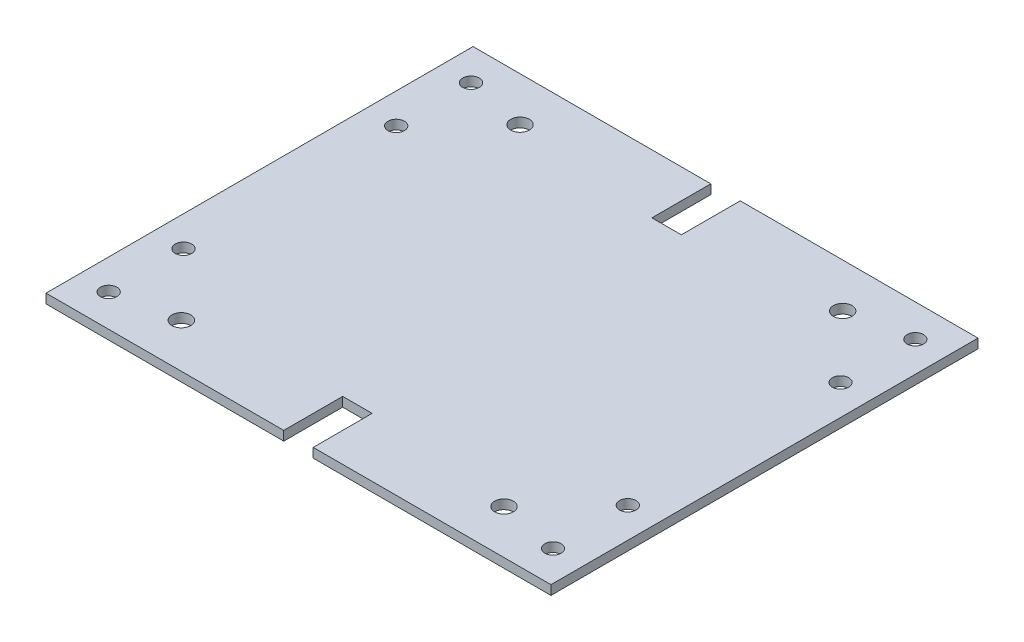
ISO-10303-21;
HEADER;
FILE_DESCRIPTION(('STEP AP214'),'2;1');
FILE_NAME('part.step','',(''),(''),'','','');
FILE_SCHEMA(('AUTOMOTIVE_DESIGN { 1 0 10303 214 1 1 1 1 }'));
ENDSEC;
DATA;
#1=APPLICATION_CONTEXT('core data for automotive mechanical design processes');
#2=APPLICATION_PROTOCOL_DEFINITION('international standard','automotive_design',2000,#1);
#3=PRODUCT_CONTEXT('',#1,'mechanical');
#4=PRODUCT('Part','Part','',(#3));
#5=PRODUCT_RELATED_PRODUCT_CATEGORY('part','',(#4));
#6=PRODUCT_DEFINITION_FORMATION('','',#4);
#7=PRODUCT_DEFINITION_CONTEXT('part definition',#1,'design');
#8=PRODUCT_DEFINITION('design','',#6,#7);
#9=PRODUCT_DEFINITION_SHAPE('','',#8);
#10=(LENGTH_UNIT() NAMED_UNIT(*) SI_UNIT(.MILLI.,.METRE.));
#11=(NAMED_UNIT(*) PLANE_ANGLE_UNIT() SI_UNIT($,.RADIAN.));
#12=(NAMED_UNIT(*) SI_UNIT($,.STERADIAN.) SOLID_ANGLE_UNIT());
#13=UNCERTAINTY_MEASURE_WITH_UNIT(LENGTH_MEASURE(1.E-05),#10,'distance_accuracy_value','');
#14=(GEOMETRIC_REPRESENTATION_CONTEXT(3) GLOBAL_UNCERTAINTY_ASSIGNED_CONTEXT((#13)) GLOBAL_UNIT_ASSIGNED_CONTEXT((#10,
#11,#12)) REPRESENTATION_CONTEXT('',''));
#15=CARTESIAN_POINT('',(0.,0.,0.));
#16=DIRECTION('',(0.,0.,1.));
#17=DIRECTION('',(1.,0.,0.));
#18=AXIS2_PLACEMENT_3D('',#15,#16,#17);
#19=CARTESIAN_POINT('',(0.,3.175,0.));
#20=DIRECTION('',(0.,1.,0.));
#21=DIRECTION('',(0.,0.,1.));
#22=AXIS2_PLACEMENT_3D('',#19,#20,#21);
#23=PLANE('',#22);
#24=CARTESIAN_POINT('',(145.213,3.175,-134.0145));
#25=DIRECTION('',(0.,-1.,0.));
#26=DIRECTION('',(0.,0.,-1.));
#27=AXIS2_PLACEMENT_3D('',#24,#25,#26);
#28=CIRCLE('',#27,2.79399999999998);
#29=CARTESIAN_POINT('',(145.213,3.175,-136.8085));
#30=VERTEX_POINT('',#29);
#31=EDGE_CURVE('E1172',#30,#30,#28,.T.);
#32=ORIENTED_EDGE('',*,*,#31,.T.);
#33=EDGE_LOOP('',(#32));
#34=FACE_BOUND('',#33,.T.);
#35=CARTESIAN_POINT('',(145.213,3.175,-108.6145));
#36=DIRECTION('',(0.,-1.,0.));
#37=DIRECTION('',(0.,0.,-1.));
#38=AXIS2_PLACEMENT_3D('',#35,#36,#37);
#39=CIRCLE('',#38,2.79399999999998);
#40=CARTESIAN_POINT('',(145.213,3.175,-111.4085));
#41=VERTEX_POINT('',#40);
#42=EDGE_CURVE('E1166',#41,#41,#39,.T.);
#43=ORIENTED_EDGE('',*,*,#42,.T.);
#44=EDGE_LOOP('',(#43));
#45=FACE_BOUND('',#44,.T.);
#46=CARTESIAN_POINT('',(145.213,3.175,-10.9855));
#47=DIRECTION('',(0.,1.,0.));
#48=DIRECTION('',(0.,0.,1.));
#49=AXIS2_PLACEMENT_3D('',#46,#47,#48);
#50=CIRCLE('',#49,2.79399999999998);
#51=CARTESIAN_POINT('',(145.213,3.175,-8.19150000000003));
#52=VERTEX_POINT('',#51);
#53=EDGE_CURVE('E1154',#52,#52,#50,.T.);
#54=ORIENTED_EDGE('',*,*,#53,.F.);
#55=EDGE_LOOP('',(#54));
#56=FACE_BOUND('',#55,.T.);
#57=CARTESIAN_POINT('',(-5.663,3.175,-10.9855));
#58=DIRECTION('',(0.,-1.,0.));
#59=DIRECTION('',(0.,0.,-1.));
#60=AXIS2_PLACEMENT_3D('',#57,#58,#59);
#61=CIRCLE('',#60,2.794);
#62=CARTESIAN_POINT('',(-5.663,3.175,-13.7795));
#63=VERTEX_POINT('',#62);
#64=EDGE_CURVE('E1148',#63,#63,#61,.T.);
#65=ORIENTED_EDGE('',*,*,#64,.T.);
#66=EDGE_LOOP('',(#65));
#67=FACE_BOUND('',#66,.T.);
#68=CARTESIAN_POINT('',(-5.663,3.175,-36.3855));
#69=DIRECTION('',(0.,-1.,0.));
#70=DIRECTION('',(0.,0.,-1.));
#71=AXIS2_PLACEMENT_3D('',#68,#69,#70);
#72=CIRCLE('',#71,2.794);
#73=CARTESIAN_POINT('',(-5.663,3.175,-39.1795));
#74=VERTEX_POINT('',#73);
#75=EDGE_CURVE('E1142',#74,#74,#72,.T.);
#76=ORIENTED_EDGE('',*,*,#75,.T.);
#77=EDGE_LOOP('',(#76));
#78=FACE_BOUND('',#77,.T.);
#79=CARTESIAN_POINT('',(-5.663,3.175,-134.0145));
#80=DIRECTION('',(0.,1.,0.));
#81=DIRECTION('',(0.,0.,1.));
#82=AXIS2_PLACEMENT_3D('',#79,#80,#81);
#83=CIRCLE('',#82,2.794);
#84=CARTESIAN_POINT('',(-5.663,3.175,-131.2205));
#85=VERTEX_POINT('',#84);
#86=EDGE_CURVE('E1130',#85,#85,#83,.T.);
#87=ORIENTED_EDGE('',*,*,#86,.F.);
#88=EDGE_LOOP('',(#87));
#89=FACE_BOUND('',#88,.T.);
#90=CARTESIAN_POINT('',(15.,3.175,-15.));
#91=DIRECTION('',(0.,-1.,0.));
#92=DIRECTION('',(0.,0.,-1.));
#93=AXIS2_PLACEMENT_3D('',#90,#91,#92);
#94=CIRCLE('',#93,3.175);
#95=CARTESIAN_POINT('',(15.,3.175,-18.175));
#96=VERTEX_POINT('',#95);
#97=EDGE_CURVE('E1124',#96,#96,#94,.T.);
#98=ORIENTED_EDGE('',*,*,#97,.T.);
#99=EDGE_LOOP('',(#98));
#100=FACE_BOUND('',#99,.T.);
#101=CARTESIAN_POINT('',(124.55,3.175,-15.));
#102=DIRECTION('',(0.,1.,0.));
#103=DIRECTION('',(0.,0.,1.));
#104=AXIS2_PLACEMENT_3D('',#101,#102,#103);
#105=CIRCLE('',#104,3.175);
#106=CARTESIAN_POINT('',(124.55,3.175,-11.825));
#107=VERTEX_POINT('',#106);
#108=EDGE_CURVE('E771',#107,#107,#105,.T.);
#109=ORIENTED_EDGE('',*,*,#108,.F.);
#110=EDGE_LOOP('',(#109));
#111=FACE_BOUND('',#110,.T.);
#112=DIRECTION('',(0.,0.,1.));
#113=VECTOR('',#112,1.);
#114=CARTESIAN_POINT('',(74.775,3.175,-20.));
#115=LINE('',#114,#113);
#116=CARTESIAN_POINT('',(74.775,3.175,-20.));
#117=VERTEX_POINT('',#116);
#118=CARTESIAN_POINT('',(74.775,3.175,0.));
#119=VERTEX_POINT('',#118);
#120=EDGE_CURVE('E797',#117,#119,#115,.T.);
#121=ORIENTED_EDGE('',*,*,#120,.T.);
#122=DIRECTION('',(1.,0.,0.));
#123=VECTOR('',#122,1.);
#124=CARTESIAN_POINT('',(74.775,3.175,0.));
#125=LINE('',#124,#123);
#126=CARTESIAN_POINT('',(155.5,3.175,0.));
#127=VERTEX_POINT('',#126);
#128=EDGE_CURVE('E716',#119,#127,#125,.T.);
#129=ORIENTED_EDGE('',*,*,#128,.T.);
#130=DIRECTION('',(0.,0.,1.));
#131=VECTOR('',#130,1.);
#132=CARTESIAN_POINT('',(155.5,3.175,-145.));
#133=LINE('',#132,#131);
#134=CARTESIAN_POINT('',(155.5,3.175,-145.));
#135=VERTEX_POINT('',#134);
#136=EDGE_CURVE('E821',#135,#127,#133,.T.);
#137=ORIENTED_EDGE('',*,*,#136,.F.);
#138=DIRECTION('',(1.,0.,0.));
#139=VECTOR('',#138,1.);
#140=CARTESIAN_POINT('',(139.55,3.175,-145.));
#141=LINE('',#140,#139);
#142=CARTESIAN_POINT('',(74.775,3.175,-145.));
#143=VERTEX_POINT('',#142);
#144=EDGE_CURVE('E834',#143,#135,#141,.T.);
#145=ORIENTED_EDGE('',*,*,#144,.F.);
#146=DIRECTION('',(0.,0.,1.));
#147=VECTOR('',#146,1.);
#148=CARTESIAN_POINT('',(74.775,3.175,-145.));
#149=LINE('',#148,#147);
#150=CARTESIAN_POINT('',(74.775,3.175,-125.));
#151=VERTEX_POINT('',#150);
#152=EDGE_CURVE('E836',#143,#151,#149,.T.);
#153=ORIENTED_EDGE('',*,*,#152,.T.);
#154=DIRECTION('',(1.,0.,0.));
#155=VECTOR('',#154,1.);
#156=CARTESIAN_POINT('',(64.775,3.175,-125.));
#157=LINE('',#156,#155);
#158=CARTESIAN_POINT('',(64.775,3.175,-125.));
#159=VERTEX_POINT('',#158);
#160=EDGE_CURVE('E842',#159,#151,#157,.T.);
#161=ORIENTED_EDGE('',*,*,#160,.F.);
#162=DIRECTION('',(0.,0.,1.));
#163=VECTOR('',#162,1.);
#164=CARTESIAN_POINT('',(64.775,3.175,-130.));
#165=LINE('',#164,#163);
#166=CARTESIAN_POINT('',(64.775,3.175,-145.));
#167=VERTEX_POINT('',#166);
#168=EDGE_CURVE('E845',#167,#159,#165,.T.);
#169=ORIENTED_EDGE('',*,*,#168,.F.);
#170=DIRECTION('',(1.,0.,0.));
#171=VECTOR('',#170,1.);
#172=CARTESIAN_POINT('',(0.,3.175,-145.));
#173=LINE('',#172,#171);
#174=CARTESIAN_POINT('',(-15.95,3.175,-145.));
#175=VERTEX_POINT('',#174);
#176=EDGE_CURVE('E848',#175,#167,#173,.T.);
#177=ORIENTED_EDGE('',*,*,#176,.F.);
#178=DIRECTION('',(0.,0.,1.));
#179=VECTOR('',#178,1.);
#180=CARTESIAN_POINT('',(-15.95,3.175,-145.));
#181=LINE('',#180,#179);
#182=CARTESIAN_POINT('',(-15.95,3.175,0.));
#183=VERTEX_POINT('',#182);
#184=EDGE_CURVE('E747',#175,#183,#181,.T.);
#185=ORIENTED_EDGE('',*,*,#184,.T.);
#186=DIRECTION('',(-1.,0.,0.));
#187=VECTOR('',#186,1.);
#188=CARTESIAN_POINT('',(0.,3.175,0.));
#189=LINE('',#188,#187);
#190=CARTESIAN_POINT('',(64.775,3.175,0.));
#191=VERTEX_POINT('',#190);
#192=EDGE_CURVE('E741',#191,#183,#189,.T.);
#193=ORIENTED_EDGE('',*,*,#192,.F.);
#194=DIRECTION('',(0.,0.,1.));
#195=VECTOR('',#194,1.);
#196=CARTESIAN_POINT('',(64.775,3.175,-20.));
#197=LINE('',#196,#195);
#198=CARTESIAN_POINT('',(64.775,3.175,-20.));
#199=VERTEX_POINT('',#198);
#200=EDGE_CURVE('E745',#199,#191,#197,.T.);
#201=ORIENTED_EDGE('',*,*,#200,.F.);
#202=DIRECTION('',(1.,0.,0.));
#203=VECTOR('',#202,1.);
#204=CARTESIAN_POINT('',(64.775,3.175,-20.));
#205=LINE('',#204,#203);
#206=EDGE_CURVE('E665',#199,#117,#205,.T.);
#207=ORIENTED_EDGE('',*,*,#206,.T.);
#208=EDGE_LOOP('',(#121,#129,#137,#145,#153,#161,#169,#177,#185,#193,#201,#207));
#209=FACE_BOUND('',#208,.T.);
#210=CARTESIAN_POINT('',(124.55,3.175,-130.));
#211=DIRECTION('',(0.,-1.,0.));
#212=DIRECTION('',(0.,0.,-1.));
#213=AXIS2_PLACEMENT_3D('',#210,#211,#212);
#214=CIRCLE('',#213,3.175);
#215=CARTESIAN_POINT('',(124.55,3.175,-133.175));
#216=VERTEX_POINT('',#215);
#217=EDGE_CURVE('E1112',#216,#216,#214,.T.);
#218=ORIENTED_EDGE('',*,*,#217,.T.);
#219=EDGE_LOOP('',(#218));
#220=FACE_BOUND('',#219,.T.);
#221=CARTESIAN_POINT('',(15.,3.175,-130.));
#222=DIRECTION('',(0.,1.,0.));
#223=DIRECTION('',(0.,0.,1.));
#224=AXIS2_PLACEMENT_3D('',#221,#222,#223);
#225=CIRCLE('',#224,3.175);
#226=CARTESIAN_POINT('',(15.,3.175,-126.825));
#227=VERTEX_POINT('',#226);
#228=EDGE_CURVE('E1118',#227,#227,#225,.T.);
#229=ORIENTED_EDGE('',*,*,#228,.F.);
#230=EDGE_LOOP('',(#229));
#231=FACE_BOUND('',#230,.T.);
#232=CARTESIAN_POINT('',(-5.663,3.175,-108.6145));
#233=DIRECTION('',(0.,1.,0.));
#234=DIRECTION('',(0.,0.,1.));
#235=AXIS2_PLACEMENT_3D('',#232,#233,#234);
#236=CIRCLE('',#235,2.79400000000001);
#237=CARTESIAN_POINT('',(-5.663,3.175,-105.8205));
#238=VERTEX_POINT('',#237);
#239=EDGE_CURVE('E1136',#238,#238,#236,.T.);
#240=ORIENTED_EDGE('',*,*,#239,.F.);
#241=EDGE_LOOP('',(#240));
#242=FACE_BOUND('',#241,.T.);
#243=CARTESIAN_POINT('',(145.213,3.175,-36.3855));
#244=DIRECTION('',(0.,1.,0.));
#245=DIRECTION('',(0.,0.,1.));
#246=AXIS2_PLACEMENT_3D('',#243,#244,#245);
#247=CIRCLE('',#246,2.79399999999998);
#248=CARTESIAN_POINT('',(145.213,3.175,-33.5915));
#249=VERTEX_POINT('',#248);
#250=EDGE_CURVE('E1160',#249,#249,#247,.T.);
#251=ORIENTED_EDGE('',*,*,#250,.F.);
#252=EDGE_LOOP('',(#251));
#253=FACE_BOUND('',#252,.T.);
#254=ADVANCED_FACE('F648',(#34,#45,#56,#67,#78,#89,#100,#111,#209,#220,#231,#242,#253),#23,.T.);
#255=CARTESIAN_POINT('',(0.,0.,0.));
#256=DIRECTION('',(0.,1.,0.));
#257=DIRECTION('',(0.,0.,1.));
#258=AXIS2_PLACEMENT_3D('',#255,#256,#257);
#259=PLANE('',#258);
#260=CARTESIAN_POINT('',(145.213,0.,-134.0145));
#261=DIRECTION('',(0.,-1.,0.));
#262=DIRECTION('',(0.,0.,-1.));
#263=AXIS2_PLACEMENT_3D('',#260,#261,#262);
#264=CIRCLE('',#263,2.79399999999998);
#265=CARTESIAN_POINT('',(145.213,0.,-136.8085));
#266=VERTEX_POINT('',#265);
#267=EDGE_CURVE('E1175',#266,#266,#264,.T.);
#268=ORIENTED_EDGE('',*,*,#267,.F.);
#269=EDGE_LOOP('',(#268));
#270=FACE_BOUND('',#269,.T.);
#271=CARTESIAN_POINT('',(145.213,0.,-108.6145));
#272=DIRECTION('',(0.,-1.,0.));
#273=DIRECTION('',(0.,0.,-1.));
#274=AXIS2_PLACEMENT_3D('',#271,#272,#273);
#275=CIRCLE('',#274,2.79399999999998);
#276=CARTESIAN_POINT('',(145.213,0.,-111.4085));
#277=VERTEX_POINT('',#276);
#278=EDGE_CURVE('E1169',#277,#277,#275,.T.);
#279=ORIENTED_EDGE('',*,*,#278,.F.);
#280=EDGE_LOOP('',(#279));
#281=FACE_BOUND('',#280,.T.);
#282=CARTESIAN_POINT('',(-5.663,0.,-10.9855));
#283=DIRECTION('',(0.,-1.,0.));
#284=DIRECTION('',(0.,0.,-1.));
#285=AXIS2_PLACEMENT_3D('',#282,#283,#284);
#286=CIRCLE('',#285,2.794);
#287=CARTESIAN_POINT('',(-5.663,0.,-13.7795));
#288=VERTEX_POINT('',#287);
#289=EDGE_CURVE('E1151',#288,#288,#286,.T.);
#290=ORIENTED_EDGE('',*,*,#289,.F.);
#291=EDGE_LOOP('',(#290));
#292=FACE_BOUND('',#291,.T.);
#293=CARTESIAN_POINT('',(-5.663,0.,-36.3855));
#294=DIRECTION('',(0.,-1.,0.));
#295=DIRECTION('',(0.,0.,-1.));
#296=AXIS2_PLACEMENT_3D('',#293,#294,#295);
#297=CIRCLE('',#296,2.794);
#298=CARTESIAN_POINT('',(-5.663,0.,-39.1795));
#299=VERTEX_POINT('',#298);
#300=EDGE_CURVE('E1145',#299,#299,#297,.T.);
#301=ORIENTED_EDGE('',*,*,#300,.F.);
#302=EDGE_LOOP('',(#301));
#303=FACE_BOUND('',#302,.T.);
#304=CARTESIAN_POINT('',(15.,0.,-15.));
#305=DIRECTION('',(0.,-1.,0.));
#306=DIRECTION('',(0.,0.,-1.));
#307=AXIS2_PLACEMENT_3D('',#304,#305,#306);
#308=CIRCLE('',#307,3.175);
#309=CARTESIAN_POINT('',(15.,0.,-18.175));
#310=VERTEX_POINT('',#309);
#311=EDGE_CURVE('E1127',#310,#310,#308,.T.);
#312=ORIENTED_EDGE('',*,*,#311,.F.);
#313=EDGE_LOOP('',(#312));
#314=FACE_BOUND('',#313,.T.);
#315=CARTESIAN_POINT('',(124.55,0.,-130.));
#316=DIRECTION('',(0.,-1.,0.));
#317=DIRECTION('',(0.,0.,-1.));
#318=AXIS2_PLACEMENT_3D('',#315,#316,#317);
#319=CIRCLE('',#318,3.175);
#320=CARTESIAN_POINT('',(124.55,0.,-133.175));
#321=VERTEX_POINT('',#320);
#322=EDGE_CURVE('E1115',#321,#321,#319,.T.);
#323=ORIENTED_EDGE('',*,*,#322,.F.);
#324=EDGE_LOOP('',(#323));
#325=FACE_BOUND('',#324,.T.);
#326=DIRECTION('',(0.,0.,1.));
#327=VECTOR('',#326,1.);
#328=CARTESIAN_POINT('',(74.775,0.,-20.));
#329=LINE('',#328,#327);
#330=CARTESIAN_POINT('',(74.775,0.,-20.));
#331=VERTEX_POINT('',#330);
#332=CARTESIAN_POINT('',(74.775,0.,0.));
#333=VERTEX_POINT('',#332);
#334=EDGE_CURVE('E767',#331,#333,#329,.T.);
#335=ORIENTED_EDGE('',*,*,#334,.F.);
#336=DIRECTION('',(1.,0.,0.));
#337=VECTOR('',#336,1.);
#338=CARTESIAN_POINT('',(64.775,0.,-20.));
#339=LINE('',#338,#337);
#340=CARTESIAN_POINT('',(64.775,0.,-20.));
#341=VERTEX_POINT('',#340);
#342=EDGE_CURVE('E708',#341,#331,#339,.T.);
#343=ORIENTED_EDGE('',*,*,#342,.F.);
#344=DIRECTION('',(0.,0.,1.));
#345=VECTOR('',#344,1.);
#346=CARTESIAN_POINT('',(64.775,0.,-20.));
#347=LINE('',#346,#345);
#348=CARTESIAN_POINT('',(64.775,0.,0.));
#349=VERTEX_POINT('',#348);
#350=EDGE_CURVE('E794',#341,#349,#347,.T.);
#351=ORIENTED_EDGE('',*,*,#350,.T.);
#352=DIRECTION('',(1.,0.,0.));
#353=VECTOR('',#352,1.);
#354=CARTESIAN_POINT('',(0.,0.,0.));
#355=LINE('',#354,#353);
#356=CARTESIAN_POINT('',(-15.95,0.,0.));
#357=VERTEX_POINT('',#356);
#358=EDGE_CURVE('E755',#357,#349,#355,.T.);
#359=ORIENTED_EDGE('',*,*,#358,.F.);
#360=DIRECTION('',(0.,0.,1.));
#361=VECTOR('',#360,1.);
#362=CARTESIAN_POINT('',(-15.95,0.,-145.));
#363=LINE('',#362,#361);
#364=CARTESIAN_POINT('',(-15.95,0.,-145.));
#365=VERTEX_POINT('',#364);
#366=EDGE_CURVE('E790',#365,#357,#363,.T.);
#367=ORIENTED_EDGE('',*,*,#366,.F.);
#368=DIRECTION('',(-1.,0.,0.));
#369=VECTOR('',#368,1.);
#370=CARTESIAN_POINT('',(0.,0.,-145.));
#371=LINE('',#370,#369);
#372=CARTESIAN_POINT('',(64.775,0.,-145.));
#373=VERTEX_POINT('',#372);
#374=EDGE_CURVE('E788',#373,#365,#371,.T.);
#375=ORIENTED_EDGE('',*,*,#374,.F.);
#376=DIRECTION('',(0.,0.,-1.));
#377=VECTOR('',#376,1.);
#378=CARTESIAN_POINT('',(64.775,0.,-130.));
#379=LINE('',#378,#377);
#380=CARTESIAN_POINT('',(64.775,0.,-125.));
#381=VERTEX_POINT('',#380);
#382=EDGE_CURVE('E785',#381,#373,#379,.T.);
#383=ORIENTED_EDGE('',*,*,#382,.F.);
#384=DIRECTION('',(1.,0.,0.));
#385=VECTOR('',#384,1.);
#386=CARTESIAN_POINT('',(64.775,0.,-125.));
#387=LINE('',#386,#385);
#388=CARTESIAN_POINT('',(74.775,0.,-125.));
#389=VERTEX_POINT('',#388);
#390=EDGE_CURVE('E782',#381,#389,#387,.T.);
#391=ORIENTED_EDGE('',*,*,#390,.T.);
#392=DIRECTION('',(0.,0.,1.));
#393=VECTOR('',#392,1.);
#394=CARTESIAN_POINT('',(74.775,0.,-145.));
#395=LINE('',#394,#393);
#396=CARTESIAN_POINT('',(74.775,0.,-145.));
#397=VERTEX_POINT('',#396);
#398=EDGE_CURVE('E779',#397,#389,#395,.T.);
#399=ORIENTED_EDGE('',*,*,#398,.F.);
#400=DIRECTION('',(1.,0.,0.));
#401=VECTOR('',#400,1.);
#402=CARTESIAN_POINT('',(74.775,0.,-145.));
#403=LINE('',#402,#401);
#404=CARTESIAN_POINT('',(155.5,0.,-145.));
#405=VERTEX_POINT('',#404);
#406=EDGE_CURVE('E777',#397,#405,#403,.T.);
#407=ORIENTED_EDGE('',*,*,#406,.T.);
#408=DIRECTION('',(0.,0.,1.));
#409=VECTOR('',#408,1.);
#410=CARTESIAN_POINT('',(155.5,0.,-145.));
#411=LINE('',#410,#409);
#412=CARTESIAN_POINT('',(155.5,0.,0.));
#413=VERTEX_POINT('',#412);
#414=EDGE_CURVE('E774',#405,#413,#411,.T.);
#415=ORIENTED_EDGE('',*,*,#414,.T.);
#416=DIRECTION('',(1.,0.,0.));
#417=VECTOR('',#416,1.);
#418=CARTESIAN_POINT('',(74.775,0.,0.));
#419=LINE('',#418,#417);
#420=EDGE_CURVE('E770',#333,#413,#419,.T.);
#421=ORIENTED_EDGE('',*,*,#420,.F.);
#422=EDGE_LOOP('',(#335,#343,#351,#359,#367,#375,#383,#391,#399,#407,#415,#421));
#423=FACE_BOUND('',#422,.T.);
#424=CARTESIAN_POINT('',(124.55,0.,-15.));
#425=DIRECTION('',(0.,1.,0.));
#426=DIRECTION('',(0.,0.,1.));
#427=AXIS2_PLACEMENT_3D('',#424,#425,#426);
#428=CIRCLE('',#427,3.175);
#429=CARTESIAN_POINT('',(124.55,0.,-11.825));
#430=VERTEX_POINT('',#429);
#431=EDGE_CURVE('E1109',#430,#430,#428,.T.);
#432=ORIENTED_EDGE('',*,*,#431,.T.);
#433=EDGE_LOOP('',(#432));
#434=FACE_BOUND('',#433,.T.);
#435=CARTESIAN_POINT('',(15.,0.,-130.));
#436=DIRECTION('',(0.,1.,0.));
#437=DIRECTION('',(0.,0.,1.));
#438=AXIS2_PLACEMENT_3D('',#435,#436,#437);
#439=CIRCLE('',#438,3.175);
#440=CARTESIAN_POINT('',(15.,0.,-126.825));
#441=VERTEX_POINT('',#440);
#442=EDGE_CURVE('E1121',#441,#441,#439,.T.);
#443=ORIENTED_EDGE('',*,*,#442,.T.);
#444=EDGE_LOOP('',(#443));
#445=FACE_BOUND('',#444,.T.);
#446=CARTESIAN_POINT('',(-5.663,0.,-134.0145));
#447=DIRECTION('',(0.,1.,0.));
#448=DIRECTION('',(0.,0.,1.));
#449=AXIS2_PLACEMENT_3D('',#446,#447,#448);
#450=CIRCLE('',#449,2.794);
#451=CARTESIAN_POINT('',(-5.663,0.,-131.2205));
#452=VERTEX_POINT('',#451);
#453=EDGE_CURVE('E1133',#452,#452,#450,.T.);
#454=ORIENTED_EDGE('',*,*,#453,.T.);
#455=EDGE_LOOP('',(#454));
#456=FACE_BOUND('',#455,.T.);
#457=CARTESIAN_POINT('',(-5.663,0.,-108.6145));
#458=DIRECTION('',(0.,1.,0.));
#459=DIRECTION('',(0.,0.,1.));
#460=AXIS2_PLACEMENT_3D('',#457,#458,#459);
#461=CIRCLE('',#460,2.79400000000001);
#462=CARTESIAN_POINT('',(-5.663,0.,-105.8205));
#463=VERTEX_POINT('',#462);
#464=EDGE_CURVE('E1139',#463,#463,#461,.T.);
#465=ORIENTED_EDGE('',*,*,#464,.T.);
#466=EDGE_LOOP('',(#465));
#467=FACE_BOUND('',#466,.T.);
#468=CARTESIAN_POINT('',(145.213,0.,-10.9855));
#469=DIRECTION('',(0.,1.,0.));
#470=DIRECTION('',(0.,0.,1.));
#471=AXIS2_PLACEMENT_3D('',#468,#469,#470);
#472=CIRCLE('',#471,2.79399999999998);
#473=CARTESIAN_POINT('',(145.213,0.,-8.19150000000003));
#474=VERTEX_POINT('',#473);
#475=EDGE_CURVE('E1157',#474,#474,#472,.T.);
#476=ORIENTED_EDGE('',*,*,#475,.T.);
#477=EDGE_LOOP('',(#476));
#478=FACE_BOUND('',#477,.T.);
#479=CARTESIAN_POINT('',(145.213,0.,-36.3855));
#480=DIRECTION('',(0.,1.,0.));
#481=DIRECTION('',(0.,0.,1.));
#482=AXIS2_PLACEMENT_3D('',#479,#480,#481);
#483=CIRCLE('',#482,2.79399999999998);
#484=CARTESIAN_POINT('',(145.213,0.,-33.5915));
#485=VERTEX_POINT('',#484);
#486=EDGE_CURVE('E1163',#485,#485,#483,.T.);
#487=ORIENTED_EDGE('',*,*,#486,.T.);
#488=EDGE_LOOP('',(#487));
#489=FACE_BOUND('',#488,.T.);
#490=ADVANCED_FACE('F826',(#270,#281,#292,#303,#314,#325,#423,#434,#445,#456,#467,#478,#489),
#259,.F.);
#491=CARTESIAN_POINT('',(74.775,3.175,-20.));
#492=DIRECTION('',(1.,0.,0.));
#493=DIRECTION('',(0.,0.,-1.));
#494=AXIS2_PLACEMENT_3D('',#491,#492,#493);
#495=PLANE('',#494);
#496=ORIENTED_EDGE('',*,*,#334,.T.);
#497=DIRECTION('',(0.,-1.,0.));
#498=VECTOR('',#497,1.);
#499=CARTESIAN_POINT('',(74.775,3.175,0.));
#500=LINE('',#499,#498);
#501=EDGE_CURVE('E12',#119,#333,#500,.T.);
#502=ORIENTED_EDGE('',*,*,#501,.F.);
#503=ORIENTED_EDGE('',*,*,#120,.F.);
#504=DIRECTION('',(0.,-1.,0.));
#505=VECTOR('',#504,1.);
#506=CARTESIAN_POINT('',(74.775,3.175,-20.));
#507=LINE('',#506,#505);
#508=EDGE_CURVE('E763',#117,#331,#507,.T.);
#509=ORIENTED_EDGE('',*,*,#508,.T.);
#510=EDGE_LOOP('',(#496,#502,#503,#509));
#511=FACE_BOUND('',#510,.T.);
#512=ADVANCED_FACE('F650',(#511),#495,.F.);
#513=CARTESIAN_POINT('',(74.775,3.175,0.));
#514=DIRECTION('',(0.,0.,-1.));
#515=DIRECTION('',(-1.,0.,0.));
#516=AXIS2_PLACEMENT_3D('',#513,#514,#515);
#517=PLANE('',#516);
#518=ORIENTED_EDGE('',*,*,#420,.T.);
#519=DIRECTION('',(0.,-1.,0.));
#520=VECTOR('',#519,1.);
#521=CARTESIAN_POINT('',(155.5,3.175,0.));
#522=LINE('',#521,#520);
#523=EDGE_CURVE('E657',#127,#413,#522,.T.);
#524=ORIENTED_EDGE('',*,*,#523,.F.);
#525=ORIENTED_EDGE('',*,*,#128,.F.);
#526=ORIENTED_EDGE('',*,*,#501,.T.);
#527=EDGE_LOOP('',(#518,#524,#525,#526));
#528=FACE_BOUND('',#527,.T.);
#529=ADVANCED_FACE('F822',(#528),#517,.F.);
#530=CARTESIAN_POINT('',(155.5,3.175,-145.));
#531=DIRECTION('',(1.,0.,0.));
#532=DIRECTION('',(0.,0.,-1.));
#533=AXIS2_PLACEMENT_3D('',#530,#531,#532);
#534=PLANE('',#533);
#535=ORIENTED_EDGE('',*,*,#414,.F.);
#536=DIRECTION('',(0.,-1.,0.));
#537=VECTOR('',#536,1.);
#538=CARTESIAN_POINT('',(155.5,3.175,-145.));
#539=LINE('',#538,#537);
#540=EDGE_CURVE('E814',#135,#405,#539,.T.);
#541=ORIENTED_EDGE('',*,*,#540,.F.);
#542=ORIENTED_EDGE('',*,*,#136,.T.);
#543=ORIENTED_EDGE('',*,*,#523,.T.);
#544=EDGE_LOOP('',(#535,#541,#542,#543));
#545=FACE_BOUND('',#544,.T.);
#546=ADVANCED_FACE('F819',(#545),#534,.T.);
#547=CARTESIAN_POINT('',(74.775,3.175,-145.));
#548=DIRECTION('',(0.,0.,-1.));
#549=DIRECTION('',(-1.,0.,0.));
#550=AXIS2_PLACEMENT_3D('',#547,#548,#549);
#551=PLANE('',#550);
#552=ORIENTED_EDGE('',*,*,#406,.F.);
#553=DIRECTION('',(0.,-1.,0.));
#554=VECTOR('',#553,1.);
#555=CARTESIAN_POINT('',(74.775,3.175,-145.));
#556=LINE('',#555,#554);
#557=EDGE_CURVE('E812',#143,#397,#556,.T.);
#558=ORIENTED_EDGE('',*,*,#557,.F.);
#559=ORIENTED_EDGE('',*,*,#144,.T.);
#560=ORIENTED_EDGE('',*,*,#540,.T.);
#561=EDGE_LOOP('',(#552,#558,#559,#560));
#562=FACE_BOUND('',#561,.T.);
#563=ADVANCED_FACE('F833',(#562),#551,.T.);
#564=CARTESIAN_POINT('',(74.775,3.175,-145.));
#565=DIRECTION('',(1.,0.,0.));
#566=DIRECTION('',(0.,0.,-1.));
#567=AXIS2_PLACEMENT_3D('',#564,#565,#566);
#568=PLANE('',#567);
#569=ORIENTED_EDGE('',*,*,#398,.T.);
#570=DIRECTION('',(0.,-1.,0.));
#571=VECTOR('',#570,1.);
#572=CARTESIAN_POINT('',(74.775,3.175,-125.));
#573=LINE('',#572,#571);
#574=EDGE_CURVE('E810',#151,#389,#573,.T.);
#575=ORIENTED_EDGE('',*,*,#574,.F.);
#576=ORIENTED_EDGE('',*,*,#152,.F.);
#577=ORIENTED_EDGE('',*,*,#557,.T.);
#578=EDGE_LOOP('',(#569,#575,#576,#577));
#579=FACE_BOUND('',#578,.T.);
#580=ADVANCED_FACE('F1051',(#579),#568,.F.);
#581=CARTESIAN_POINT('',(64.775,3.175,-125.));
#582=DIRECTION('',(0.,0.,-1.));
#583=DIRECTION('',(-1.,0.,0.));
#584=AXIS2_PLACEMENT_3D('',#581,#582,#583);
#585=PLANE('',#584);
#586=ORIENTED_EDGE('',*,*,#390,.F.);
#587=DIRECTION('',(0.,-1.,0.));
#588=VECTOR('',#587,1.);
#589=CARTESIAN_POINT('',(64.775,3.175,-125.));
#590=LINE('',#589,#588);
#591=EDGE_CURVE('E807',#159,#381,#590,.T.);
#592=ORIENTED_EDGE('',*,*,#591,.F.);
#593=ORIENTED_EDGE('',*,*,#160,.T.);
#594=ORIENTED_EDGE('',*,*,#574,.T.);
#595=EDGE_LOOP('',(#586,#592,#593,#594));
#596=FACE_BOUND('',#595,.T.);
#597=ADVANCED_FACE('F1041',(#596),#585,.T.);
#598=CARTESIAN_POINT('',(64.775,3.175,-130.));
#599=DIRECTION('',(-1.,0.,0.));
#600=DIRECTION('',(0.,0.,1.));
#601=AXIS2_PLACEMENT_3D('',#598,#599,#600);
#602=PLANE('',#601);
#603=ORIENTED_EDGE('',*,*,#382,.T.);
#604=DIRECTION('',(0.,-1.,0.));
#605=VECTOR('',#604,1.);
#606=CARTESIAN_POINT('',(64.775,3.175,-145.));
#607=LINE('',#606,#605);
#608=EDGE_CURVE('E804',#167,#373,#607,.T.);
#609=ORIENTED_EDGE('',*,*,#608,.F.);
#610=ORIENTED_EDGE('',*,*,#168,.T.);
#611=ORIENTED_EDGE('',*,*,#591,.T.);
#612=EDGE_LOOP('',(#603,#609,#610,#611));
#613=FACE_BOUND('',#612,.T.);
#614=ADVANCED_FACE('F856',(#613),#602,.F.);
#615=CARTESIAN_POINT('',(0.,3.175,-145.));
#616=DIRECTION('',(0.,0.,1.));
#617=DIRECTION('',(1.,0.,0.));
#618=AXIS2_PLACEMENT_3D('',#615,#616,#617);
#619=PLANE('',#618);
#620=ORIENTED_EDGE('',*,*,#374,.T.);
#621=DIRECTION('',(0.,-1.,0.));
#622=VECTOR('',#621,1.);
#623=CARTESIAN_POINT('',(-15.95,3.175,-145.));
#624=LINE('',#623,#622);
#625=EDGE_CURVE('E801',#175,#365,#624,.T.);
#626=ORIENTED_EDGE('',*,*,#625,.F.);
#627=ORIENTED_EDGE('',*,*,#176,.T.);
#628=ORIENTED_EDGE('',*,*,#608,.T.);
#629=EDGE_LOOP('',(#620,#626,#627,#628));
#630=FACE_BOUND('',#629,.T.);
#631=ADVANCED_FACE('F852',(#630),#619,.F.);
#632=CARTESIAN_POINT('',(-15.95,3.175,-145.));
#633=DIRECTION('',(1.,0.,0.));
#634=DIRECTION('',(0.,0.,-1.));
#635=AXIS2_PLACEMENT_3D('',#632,#633,#634);
#636=PLANE('',#635);
#637=ORIENTED_EDGE('',*,*,#366,.T.);
#638=DIRECTION('',(0.,-1.,0.));
#639=VECTOR('',#638,1.);
#640=CARTESIAN_POINT('',(-15.95,3.175,0.));
#641=LINE('',#640,#639);
#642=EDGE_CURVE('E759',#183,#357,#641,.T.);
#643=ORIENTED_EDGE('',*,*,#642,.F.);
#644=ORIENTED_EDGE('',*,*,#184,.F.);
#645=ORIENTED_EDGE('',*,*,#625,.T.);
#646=EDGE_LOOP('',(#637,#643,#644,#645));
#647=FACE_BOUND('',#646,.T.);
#648=ADVANCED_FACE('F860',(#647),#636,.F.);
#649=CARTESIAN_POINT('',(0.,3.175,0.));
#650=DIRECTION('',(0.,0.,-1.));
#651=DIRECTION('',(-1.,0.,0.));
#652=AXIS2_PLACEMENT_3D('',#649,#650,#651);
#653=PLANE('',#652);
#654=ORIENTED_EDGE('',*,*,#358,.T.);
#655=DIRECTION('',(0.,-1.,0.));
#656=VECTOR('',#655,1.);
#657=CARTESIAN_POINT('',(64.775,3.175,0.));
#658=LINE('',#657,#656);
#659=EDGE_CURVE('E753',#191,#349,#658,.T.);
#660=ORIENTED_EDGE('',*,*,#659,.F.);
#661=ORIENTED_EDGE('',*,*,#192,.T.);
#662=ORIENTED_EDGE('',*,*,#642,.T.);
#663=EDGE_LOOP('',(#654,#660,#661,#662));
#664=FACE_BOUND('',#663,.T.);
#665=ADVANCED_FACE('F754',(#664),#653,.F.);
#666=CARTESIAN_POINT('',(64.775,3.175,-20.));
#667=DIRECTION('',(1.,0.,0.));
#668=DIRECTION('',(0.,0.,-1.));
#669=AXIS2_PLACEMENT_3D('',#666,#667,#668);
#670=PLANE('',#669);
#671=ORIENTED_EDGE('',*,*,#350,.F.);
#672=DIRECTION('',(0.,-1.,0.));
#673=VECTOR('',#672,1.);
#674=CARTESIAN_POINT('',(64.775,3.175,-20.));
#675=LINE('',#674,#673);
#676=EDGE_CURVE('E705',#199,#341,#675,.T.);
#677=ORIENTED_EDGE('',*,*,#676,.F.);
#678=ORIENTED_EDGE('',*,*,#200,.T.);
#679=ORIENTED_EDGE('',*,*,#659,.T.);
#680=EDGE_LOOP('',(#671,#677,#678,#679));
#681=FACE_BOUND('',#680,.T.);
#682=ADVANCED_FACE('F761',(#681),#670,.T.);
#683=CARTESIAN_POINT('',(64.775,3.175,-20.));
#684=DIRECTION('',(0.,0.,-1.));
#685=DIRECTION('',(-1.,0.,0.));
#686=AXIS2_PLACEMENT_3D('',#683,#684,#685);
#687=PLANE('',#686);
#688=ORIENTED_EDGE('',*,*,#342,.T.);
#689=ORIENTED_EDGE('',*,*,#508,.F.);
#690=ORIENTED_EDGE('',*,*,#206,.F.);
#691=ORIENTED_EDGE('',*,*,#676,.T.);
#692=EDGE_LOOP('',(#688,#689,#690,#691));
#693=FACE_BOUND('',#692,.T.);
#694=ADVANCED_FACE('F883',(#693),#687,.F.);
#695=CARTESIAN_POINT('',(124.55,3.175,-15.));
#696=DIRECTION('',(0.,-1.,0.));
#697=DIRECTION('',(0.,0.,-1.));
#698=AXIS2_PLACEMENT_3D('',#695,#696,#697);
#699=CYLINDRICAL_SURFACE('',#698,3.175);
#700=ORIENTED_EDGE('',*,*,#108,.T.);
#701=EDGE_LOOP('',(#700));
#702=FACE_BOUND('',#701,.T.);
#703=ORIENTED_EDGE('',*,*,#431,.F.);
#704=EDGE_LOOP('',(#703));
#705=FACE_BOUND('',#704,.T.);
#706=ADVANCED_FACE('F880',(#702,#705),#699,.F.);
#707=CARTESIAN_POINT('',(124.55,3.175,-130.));
#708=DIRECTION('',(0.,-1.,0.));
#709=DIRECTION('',(0.,0.,-1.));
#710=AXIS2_PLACEMENT_3D('',#707,#708,#709);
#711=CYLINDRICAL_SURFACE('',#710,3.175);
#712=ORIENTED_EDGE('',*,*,#217,.F.);
#713=EDGE_LOOP('',(#712));
#714=FACE_BOUND('',#713,.T.);
#715=ORIENTED_EDGE('',*,*,#322,.T.);
#716=EDGE_LOOP('',(#715));
#717=FACE_BOUND('',#716,.T.);
#718=ADVANCED_FACE('F901',(#714,#717),#711,.F.);
#719=CARTESIAN_POINT('',(15.,3.175,-130.));
#720=DIRECTION('',(0.,-1.,0.));
#721=DIRECTION('',(0.,0.,-1.));
#722=AXIS2_PLACEMENT_3D('',#719,#720,#721);
#723=CYLINDRICAL_SURFACE('',#722,3.175);
#724=ORIENTED_EDGE('',*,*,#228,.T.);
#725=EDGE_LOOP('',(#724));
#726=FACE_BOUND('',#725,.T.);
#727=ORIENTED_EDGE('',*,*,#442,.F.);
#728=EDGE_LOOP('',(#727));
#729=FACE_BOUND('',#728,.T.);
#730=ADVANCED_FACE('F908',(#726,#729),#723,.F.);
#731=CARTESIAN_POINT('',(15.,3.175,-15.));
#732=DIRECTION('',(0.,-1.,0.));
#733=DIRECTION('',(0.,0.,-1.));
#734=AXIS2_PLACEMENT_3D('',#731,#732,#733);
#735=CYLINDRICAL_SURFACE('',#734,3.175);
#736=ORIENTED_EDGE('',*,*,#97,.F.);
#737=EDGE_LOOP('',(#736));
#738=FACE_BOUND('',#737,.T.);
#739=ORIENTED_EDGE('',*,*,#311,.T.);
#740=EDGE_LOOP('',(#739));
#741=FACE_BOUND('',#740,.T.);
#742=ADVANCED_FACE('F915',(#738,#741),#735,.F.);
#743=CARTESIAN_POINT('',(-5.663,3.175,-134.0145));
#744=DIRECTION('',(0.,-1.,0.));
#745=DIRECTION('',(0.,0.,-1.));
#746=AXIS2_PLACEMENT_3D('',#743,#744,#745);
#747=CYLINDRICAL_SURFACE('',#746,2.794);
#748=ORIENTED_EDGE('',*,*,#86,.T.);
#749=EDGE_LOOP('',(#748));
#750=FACE_BOUND('',#749,.T.);
#751=ORIENTED_EDGE('',*,*,#453,.F.);
#752=EDGE_LOOP('',(#751));
#753=FACE_BOUND('',#752,.T.);
#754=ADVANCED_FACE('F923',(#750,#753),#747,.F.);
#755=CARTESIAN_POINT('',(-5.663,3.175,-108.6145));
#756=DIRECTION('',(0.,-1.,0.));
#757=DIRECTION('',(0.,0.,-1.));
#758=AXIS2_PLACEMENT_3D('',#755,#756,#757);
#759=CYLINDRICAL_SURFACE('',#758,2.79400000000001);
#760=ORIENTED_EDGE('',*,*,#239,.T.);
#761=EDGE_LOOP('',(#760));
#762=FACE_BOUND('',#761,.T.);
#763=ORIENTED_EDGE('',*,*,#464,.F.);
#764=EDGE_LOOP('',(#763));
#765=FACE_BOUND('',#764,.T.);
#766=ADVANCED_FACE('F931',(#762,#765),#759,.F.);
#767=CARTESIAN_POINT('',(-5.663,3.175,-36.3855));
#768=DIRECTION('',(0.,-1.,0.));
#769=DIRECTION('',(0.,0.,-1.));
#770=AXIS2_PLACEMENT_3D('',#767,#768,#769);
#771=CYLINDRICAL_SURFACE('',#770,2.794);
#772=ORIENTED_EDGE('',*,*,#75,.F.);
#773=EDGE_LOOP('',(#772));
#774=FACE_BOUND('',#773,.T.);
#775=ORIENTED_EDGE('',*,*,#300,.T.);
#776=EDGE_LOOP('',(#775));
#777=FACE_BOUND('',#776,.T.);
#778=ADVANCED_FACE('F939',(#774,#777),#771,.F.);
#779=CARTESIAN_POINT('',(-5.663,3.175,-10.9855));
#780=DIRECTION('',(0.,-1.,0.));
#781=DIRECTION('',(0.,0.,-1.));
#782=AXIS2_PLACEMENT_3D('',#779,#780,#781);
#783=CYLINDRICAL_SURFACE('',#782,2.794);
#784=ORIENTED_EDGE('',*,*,#64,.F.);
#785=EDGE_LOOP('',(#784));
#786=FACE_BOUND('',#785,.T.);
#787=ORIENTED_EDGE('',*,*,#289,.T.);
#788=EDGE_LOOP('',(#787));
#789=FACE_BOUND('',#788,.T.);
#790=ADVANCED_FACE('F947',(#786,#789),#783,.F.);
#791=CARTESIAN_POINT('',(145.213,3.175,-10.9855));
#792=DIRECTION('',(0.,-1.,0.));
#793=DIRECTION('',(0.,0.,-1.));
#794=AXIS2_PLACEMENT_3D('',#791,#792,#793);
#795=CYLINDRICAL_SURFACE('',#794,2.79399999999998);
#796=ORIENTED_EDGE('',*,*,#53,.T.);
#797=EDGE_LOOP('',(#796));
#798=FACE_BOUND('',#797,.T.);
#799=ORIENTED_EDGE('',*,*,#475,.F.);
#800=EDGE_LOOP('',(#799));
#801=FACE_BOUND('',#800,.T.);
#802=ADVANCED_FACE('F955',(#798,#801),#795,.F.);
#803=CARTESIAN_POINT('',(145.213,3.175,-36.3855));
#804=DIRECTION('',(0.,-1.,0.));
#805=DIRECTION('',(0.,0.,-1.));
#806=AXIS2_PLACEMENT_3D('',#803,#804,#805);
#807=CYLINDRICAL_SURFACE('',#806,2.79399999999998);
#808=ORIENTED_EDGE('',*,*,#250,.T.);
#809=EDGE_LOOP('',(#808));
#810=FACE_BOUND('',#809,.T.);
#811=ORIENTED_EDGE('',*,*,#486,.F.);
#812=EDGE_LOOP('',(#811));
#813=FACE_BOUND('',#812,.T.);
#814=ADVANCED_FACE('F963',(#810,#813),#807,.F.);
#815=CARTESIAN_POINT('',(145.213,3.175,-108.6145));
#816=DIRECTION('',(0.,-1.,0.));
#817=DIRECTION('',(0.,0.,-1.));
#818=AXIS2_PLACEMENT_3D('',#815,#816,#817);
#819=CYLINDRICAL_SURFACE('',#818,2.79399999999998);
#820=ORIENTED_EDGE('',*,*,#42,.F.);
#821=EDGE_LOOP('',(#820));
#822=FACE_BOUND('',#821,.T.);
#823=ORIENTED_EDGE('',*,*,#278,.T.);
#824=EDGE_LOOP('',(#823));
#825=FACE_BOUND('',#824,.T.);
#826=ADVANCED_FACE('F971',(#822,#825),#819,.F.);
#827=CARTESIAN_POINT('',(145.213,3.175,-134.0145));
#828=DIRECTION('',(0.,-1.,0.));
#829=DIRECTION('',(0.,0.,-1.));
#830=AXIS2_PLACEMENT_3D('',#827,#828,#829);
#831=CYLINDRICAL_SURFACE('',#830,2.79399999999998);
#832=ORIENTED_EDGE('',*,*,#31,.F.);
#833=EDGE_LOOP('',(#832));
#834=FACE_BOUND('',#833,.T.);
#835=ORIENTED_EDGE('',*,*,#267,.T.);
#836=EDGE_LOOP('',(#835));
#837=FACE_BOUND('',#836,.T.);
#838=ADVANCED_FACE('F979',(#834,#837),#831,.F.);
#839=CLOSED_SHELL('',(#254,#490,#512,#529,#546,#563,#580,#597,#614,#631,#648,#665,#682,#694,
#706,#718,#730,#742,#754,#766,#778,#790,#802,#814,#826,#838));
#840=MANIFOLD_SOLID_BREP('B2',#839);
#841=ADVANCED_BREP_SHAPE_REPRESENTATION('',(#18,#840),#14);
#842=SHAPE_DEFINITION_REPRESENTATION(#9,#841);
ENDSEC;
END-ISO-10303-21;
